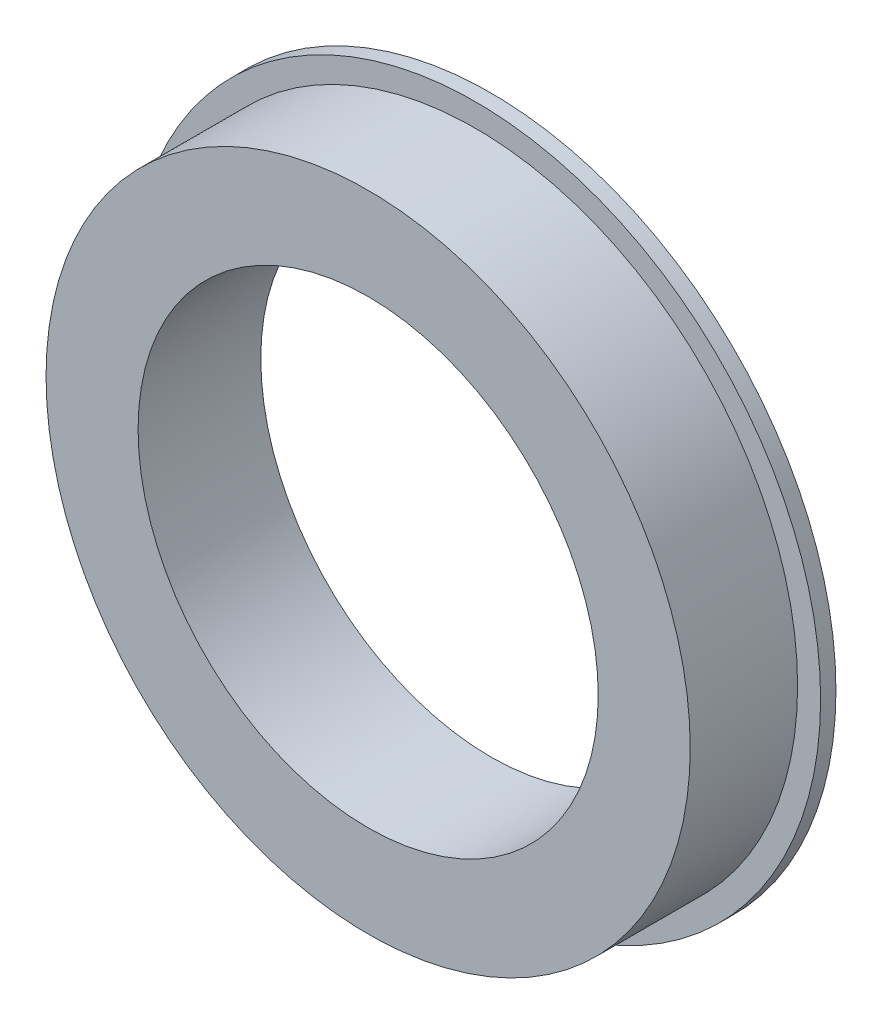
ISO-10303-21;
HEADER;
FILE_DESCRIPTION(('STEP AP214'),'2;1');
FILE_NAME('part.step','',(''),(''),'','','');
FILE_SCHEMA(('AUTOMOTIVE_DESIGN { 1 0 10303 214 1 1 1 1 }'));
ENDSEC;
DATA;
#1=APPLICATION_CONTEXT('core data for automotive mechanical design processes');
#2=APPLICATION_PROTOCOL_DEFINITION('international standard','automotive_design',2000,#1);
#3=PRODUCT_CONTEXT('',#1,'mechanical');
#4=PRODUCT('Part','Part','',(#3));
#5=PRODUCT_RELATED_PRODUCT_CATEGORY('part','',(#4));
#6=PRODUCT_DEFINITION_FORMATION('','',#4);
#7=PRODUCT_DEFINITION_CONTEXT('part definition',#1,'design');
#8=PRODUCT_DEFINITION('design','',#6,#7);
#9=PRODUCT_DEFINITION_SHAPE('','',#8);
#10=(LENGTH_UNIT() NAMED_UNIT(*) SI_UNIT(.MILLI.,.METRE.));
#11=(NAMED_UNIT(*) PLANE_ANGLE_UNIT() SI_UNIT($,.RADIAN.));
#12=(NAMED_UNIT(*) SI_UNIT($,.STERADIAN.) SOLID_ANGLE_UNIT());
#13=UNCERTAINTY_MEASURE_WITH_UNIT(LENGTH_MEASURE(1.E-05),#10,'distance_accuracy_value','');
#14=(GEOMETRIC_REPRESENTATION_CONTEXT(3) GLOBAL_UNCERTAINTY_ASSIGNED_CONTEXT((#13)) GLOBAL_UNIT_ASSIGNED_CONTEXT((#10,
#11,#12)) REPRESENTATION_CONTEXT('',''));
#15=CARTESIAN_POINT('',(0.,0.,0.));
#16=DIRECTION('',(0.,0.,1.));
#17=DIRECTION('',(1.,0.,0.));
#18=AXIS2_PLACEMENT_3D('',#15,#16,#17);
#19=CARTESIAN_POINT('',(0.,0.,4.));
#20=DIRECTION('',(0.,0.,-1.));
#21=DIRECTION('',(-1.,0.,0.));
#22=AXIS2_PLACEMENT_3D('',#19,#20,#21);
#23=CYLINDRICAL_SURFACE('',#22,7.5);
#24=CARTESIAN_POINT('',(0.,0.,4.));
#25=DIRECTION('',(0.,0.,1.));
#26=DIRECTION('',(1.,0.,0.));
#27=AXIS2_PLACEMENT_3D('',#24,#25,#26);
#28=CIRCLE('',#27,7.5);
#29=CARTESIAN_POINT('',(7.5,0.,4.));
#30=VERTEX_POINT('',#29);
#31=EDGE_CURVE('E45',#30,#30,#28,.T.);
#32=ORIENTED_EDGE('',*,*,#31,.T.);
#33=EDGE_LOOP('',(#32));
#34=FACE_BOUND('',#33,.T.);
#35=CARTESIAN_POINT('',(0.,0.,0.));
#36=DIRECTION('',(0.,0.,1.));
#37=DIRECTION('',(1.,0.,0.));
#38=AXIS2_PLACEMENT_3D('',#35,#36,#37);
#39=CIRCLE('',#38,7.5);
#40=CARTESIAN_POINT('',(7.5,0.,0.));
#41=VERTEX_POINT('',#40);
#42=EDGE_CURVE('E40',#41,#41,#39,.T.);
#43=ORIENTED_EDGE('',*,*,#42,.F.);
#44=EDGE_LOOP('',(#43));
#45=FACE_BOUND('',#44,.T.);
#46=ADVANCED_FACE('F37',(#34,#45),#23,.F.);
#47=CARTESIAN_POINT('',(0.,0.,4.));
#48=DIRECTION('',(0.,0.,-1.));
#49=DIRECTION('',(-1.,0.,0.));
#50=AXIS2_PLACEMENT_3D('',#47,#48,#49);
#51=CYLINDRICAL_SURFACE('',#50,10.5);
#52=CARTESIAN_POINT('',(0.,0.,0.5));
#53=DIRECTION('',(0.,0.,1.));
#54=DIRECTION('',(1.,0.,0.));
#55=AXIS2_PLACEMENT_3D('',#52,#53,#54);
#56=CIRCLE('',#55,10.5);
#57=CARTESIAN_POINT('',(10.5,0.,0.5));
#58=VERTEX_POINT('',#57);
#59=EDGE_CURVE('E56',#58,#58,#56,.T.);
#60=ORIENTED_EDGE('',*,*,#59,.T.);
#61=EDGE_LOOP('',(#60));
#62=FACE_BOUND('',#61,.T.);
#63=CARTESIAN_POINT('',(0.,0.,4.));
#64=DIRECTION('',(0.,0.,1.));
#65=DIRECTION('',(1.,0.,0.));
#66=AXIS2_PLACEMENT_3D('',#63,#64,#65);
#67=CIRCLE('',#66,10.5);
#68=CARTESIAN_POINT('',(10.5,0.,4.));
#69=VERTEX_POINT('',#68);
#70=EDGE_CURVE('E10',#69,#69,#67,.T.);
#71=ORIENTED_EDGE('',*,*,#70,.F.);
#72=EDGE_LOOP('',(#71));
#73=FACE_BOUND('',#72,.T.);
#74=ADVANCED_FACE('F65',(#62,#73),#51,.T.);
#75=CARTESIAN_POINT('',(0.,0.,4.));
#76=DIRECTION('',(0.,0.,1.));
#77=DIRECTION('',(1.,0.,0.));
#78=AXIS2_PLACEMENT_3D('',#75,#76,#77);
#79=PLANE('',#78);
#80=ORIENTED_EDGE('',*,*,#31,.F.);
#81=EDGE_LOOP('',(#80));
#82=FACE_BOUND('',#81,.T.);
#83=ORIENTED_EDGE('',*,*,#70,.T.);
#84=EDGE_LOOP('',(#83));
#85=FACE_BOUND('',#84,.T.);
#86=ADVANCED_FACE('F82',(#82,#85),#79,.T.);
#87=CARTESIAN_POINT('',(0.,0.,0.));
#88=DIRECTION('',(0.,0.,1.));
#89=DIRECTION('',(1.,0.,0.));
#90=AXIS2_PLACEMENT_3D('',#87,#88,#89);
#91=PLANE('',#90);
#92=ORIENTED_EDGE('',*,*,#42,.T.);
#93=EDGE_LOOP('',(#92));
#94=FACE_BOUND('',#93,.T.);
#95=CARTESIAN_POINT('',(0.,0.,0.));
#96=DIRECTION('',(0.,0.,1.));
#97=DIRECTION('',(1.,0.,0.));
#98=AXIS2_PLACEMENT_3D('',#95,#96,#97);
#99=CIRCLE('',#98,11.25);
#100=CARTESIAN_POINT('',(11.25,0.,0.));
#101=VERTEX_POINT('',#100);
#102=EDGE_CURVE('E52',#101,#101,#99,.T.);
#103=ORIENTED_EDGE('',*,*,#102,.F.);
#104=EDGE_LOOP('',(#103));
#105=FACE_BOUND('',#104,.T.);
#106=ADVANCED_FACE('F77',(#94,#105),#91,.F.);
#107=CARTESIAN_POINT('',(0.,0.,0.5));
#108=DIRECTION('',(0.,0.,-1.));
#109=DIRECTION('',(-1.,0.,0.));
#110=AXIS2_PLACEMENT_3D('',#107,#108,#109);
#111=CYLINDRICAL_SURFACE('',#110,11.25);
#112=CARTESIAN_POINT('',(0.,0.,0.5));
#113=DIRECTION('',(0.,0.,1.));
#114=DIRECTION('',(1.,0.,0.));
#115=AXIS2_PLACEMENT_3D('',#112,#113,#114);
#116=CIRCLE('',#115,11.25);
#117=CARTESIAN_POINT('',(11.25,0.,0.5));
#118=VERTEX_POINT('',#117);
#119=EDGE_CURVE('E57',#118,#118,#116,.T.);
#120=ORIENTED_EDGE('',*,*,#119,.F.);
#121=EDGE_LOOP('',(#120));
#122=FACE_BOUND('',#121,.T.);
#123=ORIENTED_EDGE('',*,*,#102,.T.);
#124=EDGE_LOOP('',(#123));
#125=FACE_BOUND('',#124,.T.);
#126=ADVANCED_FACE('F71',(#122,#125),#111,.T.);
#127=CARTESIAN_POINT('',(0.,0.,0.5));
#128=DIRECTION('',(0.,0.,1.));
#129=DIRECTION('',(1.,0.,0.));
#130=AXIS2_PLACEMENT_3D('',#127,#128,#129);
#131=PLANE('',#130);
#132=ORIENTED_EDGE('',*,*,#59,.F.);
#133=EDGE_LOOP('',(#132));
#134=FACE_BOUND('',#133,.T.);
#135=ORIENTED_EDGE('',*,*,#119,.T.);
#136=EDGE_LOOP('',(#135));
#137=FACE_BOUND('',#136,.T.);
#138=ADVANCED_FACE('F68',(#134,#137),#131,.T.);
#139=CLOSED_SHELL('',(#46,#74,#86,#106,#126,#138));
#140=MANIFOLD_SOLID_BREP('B2',#139);
#141=ADVANCED_BREP_SHAPE_REPRESENTATION('',(#18,#140),#14);
#142=SHAPE_DEFINITION_REPRESENTATION(#9,#141);
ENDSEC;
END-ISO-10303-21;
